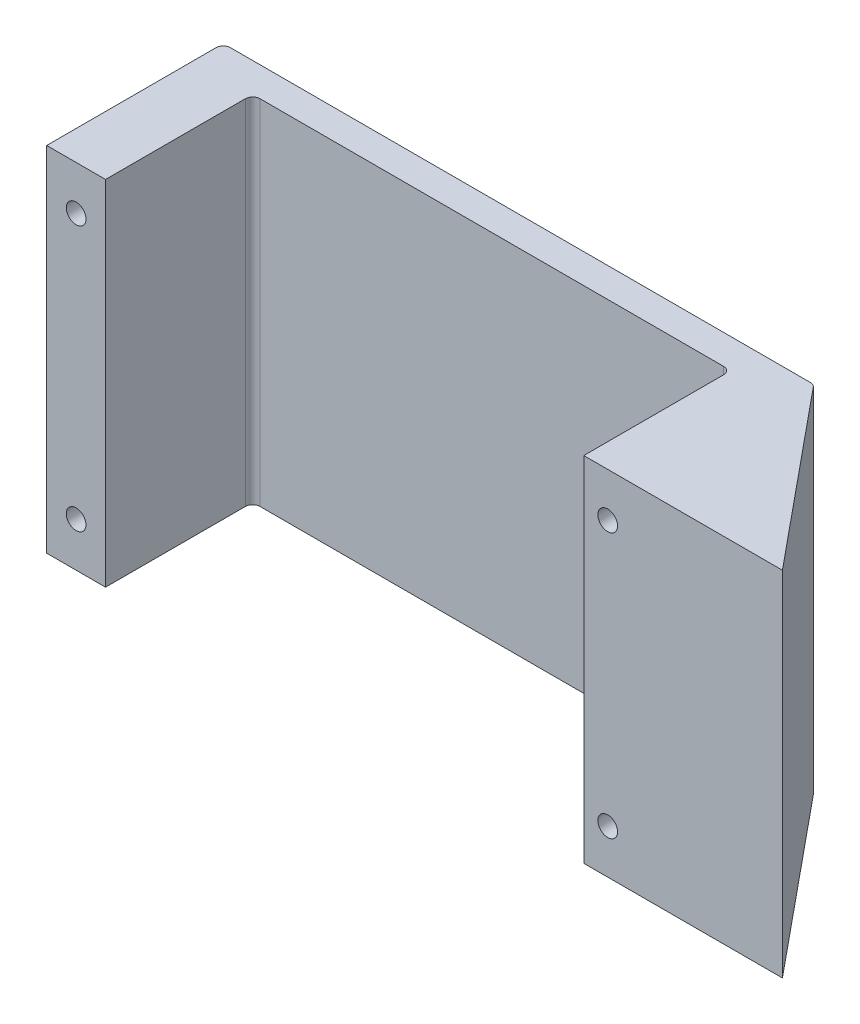
ISO-10303-21;
HEADER;
FILE_DESCRIPTION(('STEP AP214'),'2;1');
FILE_NAME('part.step','',(''),(''),'','','');
FILE_SCHEMA(('AUTOMOTIVE_DESIGN { 1 0 10303 214 1 1 1 1 }'));
ENDSEC;
DATA;
#1=APPLICATION_CONTEXT('core data for automotive mechanical design processes');
#2=APPLICATION_PROTOCOL_DEFINITION('international standard','automotive_design',2000,#1);
#3=PRODUCT_CONTEXT('',#1,'mechanical');
#4=PRODUCT('Part','Part','',(#3));
#5=PRODUCT_RELATED_PRODUCT_CATEGORY('part','',(#4));
#6=PRODUCT_DEFINITION_FORMATION('','',#4);
#7=PRODUCT_DEFINITION_CONTEXT('part definition',#1,'design');
#8=PRODUCT_DEFINITION('design','',#6,#7);
#9=PRODUCT_DEFINITION_SHAPE('','',#8);
#10=(LENGTH_UNIT() NAMED_UNIT(*) SI_UNIT(.MILLI.,.METRE.));
#11=(NAMED_UNIT(*) PLANE_ANGLE_UNIT() SI_UNIT($,.RADIAN.));
#12=(NAMED_UNIT(*) SI_UNIT($,.STERADIAN.) SOLID_ANGLE_UNIT());
#13=UNCERTAINTY_MEASURE_WITH_UNIT(LENGTH_MEASURE(1.E-05),#10,'distance_accuracy_value','');
#14=(GEOMETRIC_REPRESENTATION_CONTEXT(3) GLOBAL_UNCERTAINTY_ASSIGNED_CONTEXT((#13)) GLOBAL_UNIT_ASSIGNED_CONTEXT((#10,
#11,#12)) REPRESENTATION_CONTEXT('',''));
#15=CARTESIAN_POINT('',(0.,0.,0.));
#16=DIRECTION('',(0.,0.,1.));
#17=DIRECTION('',(1.,0.,0.));
#18=AXIS2_PLACEMENT_3D('',#15,#16,#17);
#19=CARTESIAN_POINT('',(-62.9878990236738,-40.64,46.4991854947657));
#20=DIRECTION('',(-1.,0.,0.));
#21=DIRECTION('',(0.,0.,1.));
#22=AXIS2_PLACEMENT_3D('',#19,#20,#21);
#23=PLANE('',#22);
#24=DIRECTION('',(0.,0.,1.));
#25=VECTOR('',#24,1.);
#26=CARTESIAN_POINT('',(-62.9878990236738,20.32,46.4991854947657));
#27=LINE('',#26,#25);
#28=CARTESIAN_POINT('',(-62.9878990236738,20.32,47.7691854947657));
#29=VERTEX_POINT('',#28);
#30=CARTESIAN_POINT('',(-62.9878990236738,20.32,76.9791854947657));
#31=VERTEX_POINT('',#30);
#32=EDGE_CURVE('E128',#29,#31,#27,.T.);
#33=ORIENTED_EDGE('',*,*,#32,.F.);
#34=DIRECTION('',(0.,1.,0.));
#35=VECTOR('',#34,1.);
#36=CARTESIAN_POINT('',(-62.9878990236738,-40.64,47.7691854947657));
#37=LINE('',#36,#35);
#38=CARTESIAN_POINT('',(-62.9878990236738,-40.64,47.7691854947657));
#39=VERTEX_POINT('',#38);
#40=EDGE_CURVE('E54',#29,#39,#37,.F.);
#41=ORIENTED_EDGE('',*,*,#40,.T.);
#42=DIRECTION('',(0.,0.,1.));
#43=VECTOR('',#42,1.);
#44=CARTESIAN_POINT('',(-62.9878990236738,-40.64,46.4991854947657));
#45=LINE('',#44,#43);
#46=CARTESIAN_POINT('',(-62.9878990236738,-40.64,76.9791854947657));
#47=VERTEX_POINT('',#46);
#48=EDGE_CURVE('E142',#39,#47,#45,.T.);
#49=ORIENTED_EDGE('',*,*,#48,.T.);
#50=DIRECTION('',(0.,1.,0.));
#51=VECTOR('',#50,1.);
#52=CARTESIAN_POINT('',(-62.9878990236738,-40.64,76.9791854947657));
#53=LINE('',#52,#51);
#54=EDGE_CURVE('E141',#47,#31,#53,.T.);
#55=ORIENTED_EDGE('',*,*,#54,.T.);
#56=EDGE_LOOP('',(#33,#41,#49,#55));
#57=FACE_BOUND('',#56,.T.);
#58=ADVANCED_FACE('F39',(#57),#23,.T.);
#59=CARTESIAN_POINT('',(38.9403477823427,-40.64,46.4991854947657));
#60=DIRECTION('',(0.,0.,-1.));
#61=DIRECTION('',(-1.,0.,0.));
#62=AXIS2_PLACEMENT_3D('',#59,#60,#61);
#63=PLANE('',#62);
#64=CARTESIAN_POINT('',(-57.9078990236738,-33.02,46.4991854947657));
#65=DIRECTION('',(0.,0.,-1.));
#66=DIRECTION('',(-1.,0.,0.));
#67=AXIS2_PLACEMENT_3D('',#64,#65,#66);
#68=CIRCLE('',#67,3.525);
#69=CARTESIAN_POINT('',(-61.4328990236738,-33.02,46.4991854947657));
#70=VERTEX_POINT('',#69);
#71=EDGE_CURVE('E366',#70,#70,#68,.T.);
#72=ORIENTED_EDGE('',*,*,#71,.F.);
#73=EDGE_LOOP('',(#72));
#74=FACE_BOUND('',#73,.T.);
#75=CARTESIAN_POINT('',(-57.9078990236738,12.7,46.4991854947657));
#76=DIRECTION('',(0.,0.,-1.));
#77=DIRECTION('',(-1.,0.,0.));
#78=AXIS2_PLACEMENT_3D('',#75,#76,#77);
#79=CIRCLE('',#78,3.525);
#80=CARTESIAN_POINT('',(-61.4328990236738,12.7,46.4991854947657));
#81=VERTEX_POINT('',#80);
#82=EDGE_CURVE('E379',#81,#81,#79,.T.);
#83=ORIENTED_EDGE('',*,*,#82,.F.);
#84=EDGE_LOOP('',(#83));
#85=FACE_BOUND('',#84,.T.);
#86=CARTESIAN_POINT('',(33.8603477823427,12.7,46.4991854947657));
#87=DIRECTION('',(0.,0.,-1.));
#88=DIRECTION('',(-1.,0.,0.));
#89=AXIS2_PLACEMENT_3D('',#86,#87,#88);
#90=CIRCLE('',#89,3.525);
#91=CARTESIAN_POINT('',(30.3353477823427,12.7,46.4991854947657));
#92=VERTEX_POINT('',#91);
#93=EDGE_CURVE('E394',#92,#92,#90,.T.);
#94=ORIENTED_EDGE('',*,*,#93,.F.);
#95=EDGE_LOOP('',(#94));
#96=FACE_BOUND('',#95,.T.);
#97=CARTESIAN_POINT('',(33.8603477823427,-33.02,46.4991854947657));
#98=DIRECTION('',(0.,0.,-1.));
#99=DIRECTION('',(-1.,0.,0.));
#100=AXIS2_PLACEMENT_3D('',#97,#98,#99);
#101=CIRCLE('',#100,3.525);
#102=CARTESIAN_POINT('',(30.3353477823427,-33.02,46.4991854947657));
#103=VERTEX_POINT('',#102);
#104=EDGE_CURVE('E409',#103,#103,#101,.T.);
#105=ORIENTED_EDGE('',*,*,#104,.F.);
#106=EDGE_LOOP('',(#105));
#107=FACE_BOUND('',#106,.T.);
#108=DIRECTION('',(-1.,0.,0.));
#109=VECTOR('',#108,1.);
#110=CARTESIAN_POINT('',(38.9403477823427,20.32,46.4991854947657));
#111=LINE('',#110,#109);
#112=CARTESIAN_POINT('',(38.340556854407,20.32,46.4991854947657));
#113=VERTEX_POINT('',#112);
#114=CARTESIAN_POINT('',(-61.7178990236738,20.32,46.4991854947657));
#115=VERTEX_POINT('',#114);
#116=EDGE_CURVE('E165',#113,#115,#111,.T.);
#117=ORIENTED_EDGE('',*,*,#116,.F.);
#118=DIRECTION('',(0.,1.,0.));
#119=VECTOR('',#118,1.);
#120=CARTESIAN_POINT('',(38.340556854407,-40.64,46.4991854947657));
#121=LINE('',#120,#119);
#122=CARTESIAN_POINT('',(38.340556854407,-40.64,46.4991854947657));
#123=VERTEX_POINT('',#122);
#124=EDGE_CURVE('E210',#113,#123,#121,.F.);
#125=ORIENTED_EDGE('',*,*,#124,.T.);
#126=DIRECTION('',(-1.,0.,0.));
#127=VECTOR('',#126,1.);
#128=CARTESIAN_POINT('',(38.9403477823427,-40.64,46.4991854947657));
#129=LINE('',#128,#127);
#130=CARTESIAN_POINT('',(-61.7178990236738,-40.64,46.4991854947657));
#131=VERTEX_POINT('',#130);
#132=EDGE_CURVE('E147',#123,#131,#129,.T.);
#133=ORIENTED_EDGE('',*,*,#132,.T.);
#134=DIRECTION('',(0.,1.,0.));
#135=VECTOR('',#134,1.);
#136=CARTESIAN_POINT('',(-61.7178990236738,-40.64,46.4991854947657));
#137=LINE('',#136,#135);
#138=EDGE_CURVE('E207',#131,#115,#137,.T.);
#139=ORIENTED_EDGE('',*,*,#138,.T.);
#140=EDGE_LOOP('',(#117,#125,#133,#139));
#141=FACE_BOUND('',#140,.T.);
#142=ADVANCED_FACE('F245',(#74,#85,#96,#107,#141),#63,.T.);
#143=CARTESIAN_POINT('',(64.0121009763261,-40.64,76.9791854947657));
#144=DIRECTION('',(0.772295951041188,0.,-0.635262909357526));
#145=DIRECTION('',(-0.635262909357525,0.,-0.772295951041187));
#146=AXIS2_PLACEMENT_3D('',#143,#144,#145);
#147=PLANE('',#146);
#148=DIRECTION('',(-0.635262909357525,0.,-0.772295951041187));
#149=VECTOR('',#148,1.);
#150=CARTESIAN_POINT('',(64.0121009763261,-40.64,76.9791854947657));
#151=LINE('',#150,#149);
#152=CARTESIAN_POINT('',(64.0121009763261,-40.64,76.9791854947657));
#153=VERTEX_POINT('',#152);
#154=CARTESIAN_POINT('',(39.3213727122293,-40.64,46.9624015998817));
#155=VERTEX_POINT('',#154);
#156=EDGE_CURVE('E181',#153,#155,#151,.T.);
#157=ORIENTED_EDGE('',*,*,#156,.T.);
#158=DIRECTION('',(0.,1.,0.));
#159=VECTOR('',#158,1.);
#160=CARTESIAN_POINT('',(39.3213727122293,-40.64,46.9624015998817));
#161=LINE('',#160,#159);
#162=CARTESIAN_POINT('',(39.3213727122293,20.32,46.9624015998817));
#163=VERTEX_POINT('',#162);
#164=EDGE_CURVE('E201',#155,#163,#161,.T.);
#165=ORIENTED_EDGE('',*,*,#164,.T.);
#166=DIRECTION('',(-0.635262909357525,0.,-0.772295951041187));
#167=VECTOR('',#166,1.);
#168=CARTESIAN_POINT('',(64.0121009763261,20.32,76.9791854947657));
#169=LINE('',#168,#167);
#170=CARTESIAN_POINT('',(64.0121009763261,20.32,76.9791854947657));
#171=VERTEX_POINT('',#170);
#172=EDGE_CURVE('E163',#171,#163,#169,.T.);
#173=ORIENTED_EDGE('',*,*,#172,.F.);
#174=DIRECTION('',(0.,1.,0.));
#175=VECTOR('',#174,1.);
#176=CARTESIAN_POINT('',(64.0121009763261,-40.64,76.9791854947657));
#177=LINE('',#176,#175);
#178=EDGE_CURVE('E185',#153,#171,#177,.T.);
#179=ORIENTED_EDGE('',*,*,#178,.F.);
#180=EDGE_LOOP('',(#157,#165,#173,#179));
#181=FACE_BOUND('',#180,.T.);
#182=ADVANCED_FACE('F251',(#181),#147,.T.);
#183=CARTESIAN_POINT('',(29.7221009763261,-40.64,76.9791854947657));
#184=DIRECTION('',(0.,0.,1.));
#185=DIRECTION('',(1.,0.,0.));
#186=AXIS2_PLACEMENT_3D('',#183,#184,#185);
#187=PLANE('',#186);
#188=CARTESIAN_POINT('',(33.8603477823427,12.7,76.9791854947657));
#189=DIRECTION('',(0.,0.,-1.));
#190=DIRECTION('',(-1.,0.,0.));
#191=AXIS2_PLACEMENT_3D('',#188,#189,#190);
#192=CIRCLE('',#191,1.69999999999999);
#193=CARTESIAN_POINT('',(32.1603477823427,12.7,76.9791854947657));
#194=VERTEX_POINT('',#193);
#195=EDGE_CURVE('E406',#194,#194,#192,.T.);
#196=ORIENTED_EDGE('',*,*,#195,.T.);
#197=EDGE_LOOP('',(#196));
#198=FACE_BOUND('',#197,.T.);
#199=CARTESIAN_POINT('',(33.8603477823427,-33.02,76.9791854947657));
#200=DIRECTION('',(0.,0.,-1.));
#201=DIRECTION('',(-1.,0.,0.));
#202=AXIS2_PLACEMENT_3D('',#199,#200,#201);
#203=CIRCLE('',#202,1.69999999999999);
#204=CARTESIAN_POINT('',(32.1603477823427,-33.02,76.9791854947657));
#205=VERTEX_POINT('',#204);
#206=EDGE_CURVE('E138',#205,#205,#203,.T.);
#207=ORIENTED_EDGE('',*,*,#206,.T.);
#208=EDGE_LOOP('',(#207));
#209=FACE_BOUND('',#208,.T.);
#210=ORIENTED_EDGE('',*,*,#178,.T.);
#211=DIRECTION('',(1.,0.,0.));
#212=VECTOR('',#211,1.);
#213=CARTESIAN_POINT('',(29.7221009763261,20.32,76.9791854947657));
#214=LINE('',#213,#212);
#215=CARTESIAN_POINT('',(29.7221009763261,20.32,76.9791854947657));
#216=VERTEX_POINT('',#215);
#217=EDGE_CURVE('E160',#216,#171,#214,.T.);
#218=ORIENTED_EDGE('',*,*,#217,.F.);
#219=DIRECTION('',(0.,1.,0.));
#220=VECTOR('',#219,1.);
#221=CARTESIAN_POINT('',(29.7221009763261,-40.64,76.9791854947657));
#222=LINE('',#221,#220);
#223=CARTESIAN_POINT('',(29.7221009763261,-40.64,76.9791854947657));
#224=VERTEX_POINT('',#223);
#225=EDGE_CURVE('E188',#224,#216,#222,.T.);
#226=ORIENTED_EDGE('',*,*,#225,.F.);
#227=DIRECTION('',(1.,0.,0.));
#228=VECTOR('',#227,1.);
#229=CARTESIAN_POINT('',(29.7221009763261,-40.64,76.9791854947657));
#230=LINE('',#229,#228);
#231=EDGE_CURVE('E178',#224,#153,#230,.T.);
#232=ORIENTED_EDGE('',*,*,#231,.T.);
#233=EDGE_LOOP('',(#210,#218,#226,#232));
#234=FACE_BOUND('',#233,.T.);
#235=ADVANCED_FACE('F277',(#198,#209,#234),#187,.T.);
#236=CARTESIAN_POINT('',(29.7221009763261,-40.64,51.5791854947657));
#237=DIRECTION('',(-1.,0.,0.));
#238=DIRECTION('',(0.,0.,1.));
#239=AXIS2_PLACEMENT_3D('',#236,#237,#238);
#240=PLANE('',#239);
#241=DIRECTION('',(0.,0.,1.));
#242=VECTOR('',#241,1.);
#243=CARTESIAN_POINT('',(29.7221009763261,20.32,51.5791854947657));
#244=LINE('',#243,#242);
#245=CARTESIAN_POINT('',(29.7221009763261,20.32,52.8491854947657));
#246=VERTEX_POINT('',#245);
#247=EDGE_CURVE('E158',#246,#216,#244,.T.);
#248=ORIENTED_EDGE('',*,*,#247,.F.);
#249=DIRECTION('',(0.,1.,0.));
#250=VECTOR('',#249,1.);
#251=CARTESIAN_POINT('',(29.7221009763261,-40.64,52.8491854947657));
#252=LINE('',#251,#250);
#253=CARTESIAN_POINT('',(29.7221009763261,-40.64,52.8491854947657));
#254=VERTEX_POINT('',#253);
#255=EDGE_CURVE('E196',#246,#254,#252,.F.);
#256=ORIENTED_EDGE('',*,*,#255,.T.);
#257=DIRECTION('',(0.,0.,1.));
#258=VECTOR('',#257,1.);
#259=CARTESIAN_POINT('',(29.7221009763261,-40.64,51.5791854947657));
#260=LINE('',#259,#258);
#261=EDGE_CURVE('E176',#254,#224,#260,.T.);
#262=ORIENTED_EDGE('',*,*,#261,.T.);
#263=ORIENTED_EDGE('',*,*,#225,.T.);
#264=EDGE_LOOP('',(#248,#256,#262,#263));
#265=FACE_BOUND('',#264,.T.);
#266=ADVANCED_FACE('F242',(#265),#240,.T.);
#267=CARTESIAN_POINT('',(-52.8278990236738,-40.64,51.5791854947657));
#268=DIRECTION('',(0.,0.,1.));
#269=DIRECTION('',(1.,0.,0.));
#270=AXIS2_PLACEMENT_3D('',#267,#268,#269);
#271=PLANE('',#270);
#272=DIRECTION('',(1.,0.,0.));
#273=VECTOR('',#272,1.);
#274=CARTESIAN_POINT('',(-52.8278990236738,-40.64,51.5791854947657));
#275=LINE('',#274,#273);
#276=CARTESIAN_POINT('',(-51.5578990236738,-40.64,51.5791854947657));
#277=VERTEX_POINT('',#276);
#278=CARTESIAN_POINT('',(28.4521009763261,-40.64,51.5791854947657));
#279=VERTEX_POINT('',#278);
#280=EDGE_CURVE('E173',#277,#279,#275,.T.);
#281=ORIENTED_EDGE('',*,*,#280,.T.);
#282=DIRECTION('',(0.,1.,0.));
#283=VECTOR('',#282,1.);
#284=CARTESIAN_POINT('',(28.4521009763261,20.32,51.5791854947657));
#285=LINE('',#284,#283);
#286=CARTESIAN_POINT('',(28.4521009763261,20.32,51.5791854947657));
#287=VERTEX_POINT('',#286);
#288=EDGE_CURVE('E193',#279,#287,#285,.T.);
#289=ORIENTED_EDGE('',*,*,#288,.T.);
#290=DIRECTION('',(1.,0.,0.));
#291=VECTOR('',#290,1.);
#292=CARTESIAN_POINT('',(-52.8278990236738,20.32,51.5791854947657));
#293=LINE('',#292,#291);
#294=CARTESIAN_POINT('',(-51.5578990236738,20.32,51.5791854947657));
#295=VERTEX_POINT('',#294);
#296=EDGE_CURVE('E152',#295,#287,#293,.T.);
#297=ORIENTED_EDGE('',*,*,#296,.F.);
#298=DIRECTION('',(0.,1.,0.));
#299=VECTOR('',#298,1.);
#300=CARTESIAN_POINT('',(-51.5578990236738,-40.64,51.5791854947657));
#301=LINE('',#300,#299);
#302=EDGE_CURVE('E187',#295,#277,#301,.F.);
#303=ORIENTED_EDGE('',*,*,#302,.T.);
#304=EDGE_LOOP('',(#281,#289,#297,#303));
#305=FACE_BOUND('',#304,.T.);
#306=ADVANCED_FACE('F224',(#305),#271,.T.);
#307=CARTESIAN_POINT('',(-52.8278990236738,-40.64,76.9791854947657));
#308=DIRECTION('',(1.,0.,0.));
#309=DIRECTION('',(0.,0.,-1.));
#310=AXIS2_PLACEMENT_3D('',#307,#308,#309);
#311=PLANE('',#310);
#312=DIRECTION('',(0.,0.,-1.));
#313=VECTOR('',#312,1.);
#314=CARTESIAN_POINT('',(-52.8278990236738,-40.64,76.9791854947657));
#315=LINE('',#314,#313);
#316=CARTESIAN_POINT('',(-52.8278990236738,-40.64,76.9791854947657));
#317=VERTEX_POINT('',#316);
#318=CARTESIAN_POINT('',(-52.8278990236738,-40.64,52.8491854947657));
#319=VERTEX_POINT('',#318);
#320=EDGE_CURVE('E170',#317,#319,#315,.T.);
#321=ORIENTED_EDGE('',*,*,#320,.T.);
#322=DIRECTION('',(0.,1.,0.));
#323=VECTOR('',#322,1.);
#324=CARTESIAN_POINT('',(-52.8278990236738,20.32,52.8491854947657));
#325=LINE('',#324,#323);
#326=CARTESIAN_POINT('',(-52.8278990236738,20.32,52.8491854947657));
#327=VERTEX_POINT('',#326);
#328=EDGE_CURVE('E198',#319,#327,#325,.T.);
#329=ORIENTED_EDGE('',*,*,#328,.T.);
#330=DIRECTION('',(0.,0.,-1.));
#331=VECTOR('',#330,1.);
#332=CARTESIAN_POINT('',(-52.8278990236738,20.32,76.9791854947657));
#333=LINE('',#332,#331);
#334=CARTESIAN_POINT('',(-52.8278990236738,20.32,76.9791854947657));
#335=VERTEX_POINT('',#334);
#336=EDGE_CURVE('E150',#335,#327,#333,.T.);
#337=ORIENTED_EDGE('',*,*,#336,.F.);
#338=DIRECTION('',(0.,1.,0.));
#339=VECTOR('',#338,1.);
#340=CARTESIAN_POINT('',(-52.8278990236738,-40.64,76.9791854947657));
#341=LINE('',#340,#339);
#342=EDGE_CURVE('E146',#317,#335,#341,.T.);
#343=ORIENTED_EDGE('',*,*,#342,.F.);
#344=EDGE_LOOP('',(#321,#329,#337,#343));
#345=FACE_BOUND('',#344,.T.);
#346=ADVANCED_FACE('F232',(#345),#311,.T.);
#347=CARTESIAN_POINT('',(-52.8278990236738,-40.64,76.9791854947657));
#348=DIRECTION('',(0.,0.,1.));
#349=DIRECTION('',(1.,0.,0.));
#350=AXIS2_PLACEMENT_3D('',#347,#348,#349);
#351=PLANE('',#350);
#352=CARTESIAN_POINT('',(-57.9078990236738,-33.02,76.9791854947657));
#353=DIRECTION('',(0.,0.,-1.));
#354=DIRECTION('',(-1.,0.,0.));
#355=AXIS2_PLACEMENT_3D('',#352,#353,#354);
#356=CIRCLE('',#355,1.69999999999999);
#357=CARTESIAN_POINT('',(-59.6078990236738,-33.02,76.9791854947657));
#358=VERTEX_POINT('',#357);
#359=EDGE_CURVE('E376',#358,#358,#356,.T.);
#360=ORIENTED_EDGE('',*,*,#359,.T.);
#361=EDGE_LOOP('',(#360));
#362=FACE_BOUND('',#361,.T.);
#363=CARTESIAN_POINT('',(-57.9078990236738,12.7,76.9791854947657));
#364=DIRECTION('',(0.,0.,-1.));
#365=DIRECTION('',(-1.,0.,0.));
#366=AXIS2_PLACEMENT_3D('',#363,#364,#365);
#367=CIRCLE('',#366,1.69999999999999);
#368=CARTESIAN_POINT('',(-59.6078990236738,12.7,76.9791854947657));
#369=VERTEX_POINT('',#368);
#370=EDGE_CURVE('E391',#369,#369,#367,.T.);
#371=ORIENTED_EDGE('',*,*,#370,.T.);
#372=EDGE_LOOP('',(#371));
#373=FACE_BOUND('',#372,.T.);
#374=ORIENTED_EDGE('',*,*,#342,.T.);
#375=DIRECTION('',(1.,0.,0.));
#376=VECTOR('',#375,1.);
#377=CARTESIAN_POINT('',(-52.8278990236738,20.32,76.9791854947657));
#378=LINE('',#377,#376);
#379=EDGE_CURVE('E134',#31,#335,#378,.T.);
#380=ORIENTED_EDGE('',*,*,#379,.F.);
#381=ORIENTED_EDGE('',*,*,#54,.F.);
#382=DIRECTION('',(1.,0.,0.));
#383=VECTOR('',#382,1.);
#384=CARTESIAN_POINT('',(-52.8278990236738,-40.64,76.9791854947657));
#385=LINE('',#384,#383);
#386=EDGE_CURVE('E168',#47,#317,#385,.T.);
#387=ORIENTED_EDGE('',*,*,#386,.T.);
#388=EDGE_LOOP('',(#374,#380,#381,#387));
#389=FACE_BOUND('',#388,.T.);
#390=ADVANCED_FACE('F149',(#362,#373,#389),#351,.T.);
#391=CARTESIAN_POINT('',(0.,-40.64,0.));
#392=DIRECTION('',(0.,-1.,0.));
#393=DIRECTION('',(0.,0.,-1.));
#394=AXIS2_PLACEMENT_3D('',#391,#392,#393);
#395=PLANE('',#394);
#396=ORIENTED_EDGE('',*,*,#132,.F.);
#397=CARTESIAN_POINT('',(38.340556854407,-40.64,47.7691854947657));
#398=DIRECTION('',(0.,-1.,0.));
#399=DIRECTION('',(0.,0.,-1.));
#400=AXIS2_PLACEMENT_3D('',#397,#398,#399);
#401=CIRCLE('',#400,1.27);
#402=EDGE_CURVE('E213',#123,#155,#401,.T.);
#403=ORIENTED_EDGE('',*,*,#402,.T.);
#404=ORIENTED_EDGE('',*,*,#156,.F.);
#405=ORIENTED_EDGE('',*,*,#231,.F.);
#406=ORIENTED_EDGE('',*,*,#261,.F.);
#407=CARTESIAN_POINT('',(28.4521009763261,-40.64,52.8491854947657));
#408=DIRECTION('',(0.,-1.,0.));
#409=DIRECTION('',(0.,0.,-1.));
#410=AXIS2_PLACEMENT_3D('',#407,#408,#409);
#411=CIRCLE('',#410,1.27);
#412=EDGE_CURVE('E218',#254,#279,#411,.F.);
#413=ORIENTED_EDGE('',*,*,#412,.T.);
#414=ORIENTED_EDGE('',*,*,#280,.F.);
#415=CARTESIAN_POINT('',(-51.5578990236738,-40.64,52.8491854947657));
#416=DIRECTION('',(0.,-1.,0.));
#417=DIRECTION('',(0.,0.,-1.));
#418=AXIS2_PLACEMENT_3D('',#415,#416,#417);
#419=CIRCLE('',#418,1.27);
#420=EDGE_CURVE('E11',#277,#319,#419,.F.);
#421=ORIENTED_EDGE('',*,*,#420,.T.);
#422=ORIENTED_EDGE('',*,*,#320,.F.);
#423=ORIENTED_EDGE('',*,*,#386,.F.);
#424=ORIENTED_EDGE('',*,*,#48,.F.);
#425=CARTESIAN_POINT('',(-61.7178990236738,-40.64,47.7691854947657));
#426=DIRECTION('',(0.,-1.,0.));
#427=DIRECTION('',(0.,0.,-1.));
#428=AXIS2_PLACEMENT_3D('',#425,#426,#427);
#429=CIRCLE('',#428,1.27);
#430=EDGE_CURVE('E61',#39,#131,#429,.T.);
#431=ORIENTED_EDGE('',*,*,#430,.T.);
#432=EDGE_LOOP('',(#396,#403,#404,#405,#406,#413,#414,#421,#422,#423,#424,#431));
#433=FACE_BOUND('',#432,.T.);
#434=ADVANCED_FACE('F230',(#433),#395,.T.);
#435=CARTESIAN_POINT('',(0.,20.32,0.));
#436=DIRECTION('',(0.,-1.,0.));
#437=DIRECTION('',(0.,0.,-1.));
#438=AXIS2_PLACEMENT_3D('',#435,#436,#437);
#439=PLANE('',#438);
#440=ORIENTED_EDGE('',*,*,#172,.T.);
#441=CARTESIAN_POINT('',(38.340556854407,20.32,47.7691854947657));
#442=DIRECTION('',(0.,-1.,0.));
#443=DIRECTION('',(0.,0.,-1.));
#444=AXIS2_PLACEMENT_3D('',#441,#442,#443);
#445=CIRCLE('',#444,1.27);
#446=EDGE_CURVE('E205',#163,#113,#445,.F.);
#447=ORIENTED_EDGE('',*,*,#446,.T.);
#448=ORIENTED_EDGE('',*,*,#116,.T.);
#449=CARTESIAN_POINT('',(-61.7178990236738,20.32,47.7691854947657));
#450=DIRECTION('',(0.,-1.,0.));
#451=DIRECTION('',(0.,0.,-1.));
#452=AXIS2_PLACEMENT_3D('',#449,#450,#451);
#453=CIRCLE('',#452,1.27);
#454=EDGE_CURVE('E137',#115,#29,#453,.F.);
#455=ORIENTED_EDGE('',*,*,#454,.T.);
#456=ORIENTED_EDGE('',*,*,#32,.T.);
#457=ORIENTED_EDGE('',*,*,#379,.T.);
#458=ORIENTED_EDGE('',*,*,#336,.T.);
#459=CARTESIAN_POINT('',(-51.5578990236738,20.32,52.8491854947657));
#460=DIRECTION('',(0.,-1.,0.));
#461=DIRECTION('',(0.,0.,-1.));
#462=AXIS2_PLACEMENT_3D('',#459,#460,#461);
#463=CIRCLE('',#462,1.27);
#464=EDGE_CURVE('E47',#327,#295,#463,.T.);
#465=ORIENTED_EDGE('',*,*,#464,.T.);
#466=ORIENTED_EDGE('',*,*,#296,.T.);
#467=CARTESIAN_POINT('',(28.4521009763261,20.32,52.8491854947657));
#468=DIRECTION('',(0.,-1.,0.));
#469=DIRECTION('',(0.,0.,-1.));
#470=AXIS2_PLACEMENT_3D('',#467,#468,#469);
#471=CIRCLE('',#470,1.27);
#472=EDGE_CURVE('E216',#287,#246,#471,.T.);
#473=ORIENTED_EDGE('',*,*,#472,.T.);
#474=ORIENTED_EDGE('',*,*,#247,.T.);
#475=ORIENTED_EDGE('',*,*,#217,.T.);
#476=EDGE_LOOP('',(#440,#447,#448,#455,#456,#457,#458,#465,#466,#473,#474,#475));
#477=FACE_BOUND('',#476,.T.);
#478=ADVANCED_FACE('F131',(#477),#439,.F.);
#479=CARTESIAN_POINT('',(33.8603477823427,-33.02,46.4991854947657));
#480=DIRECTION('',(0.,0.,-1.));
#481=DIRECTION('',(-1.,0.,0.));
#482=AXIS2_PLACEMENT_3D('',#479,#480,#481);
#483=CYLINDRICAL_SURFACE('',#482,1.7);
#484=ORIENTED_EDGE('',*,*,#206,.F.);
#485=EDGE_LOOP('',(#484));
#486=FACE_BOUND('',#485,.T.);
#487=CARTESIAN_POINT('',(33.8603477823427,-33.02,48.8991854947657));
#488=DIRECTION('',(0.,0.,-1.));
#489=DIRECTION('',(-1.,0.,0.));
#490=AXIS2_PLACEMENT_3D('',#487,#488,#489);
#491=CIRCLE('',#490,1.7);
#492=CARTESIAN_POINT('',(32.1603477823427,-33.02,48.8991854947657));
#493=VERTEX_POINT('',#492);
#494=EDGE_CURVE('E418',#493,#493,#491,.T.);
#495=ORIENTED_EDGE('',*,*,#494,.T.);
#496=EDGE_LOOP('',(#495));
#497=FACE_BOUND('',#496,.T.);
#498=ADVANCED_FACE('F297',(#486,#497),#483,.F.);
#499=CARTESIAN_POINT('',(37.3603477823427,-33.02,48.8991854947657));
#500=DIRECTION('',(0.,0.,1.));
#501=DIRECTION('',(1.,0.,0.));
#502=AXIS2_PLACEMENT_3D('',#499,#500,#501);
#503=PLANE('',#502);
#504=ORIENTED_EDGE('',*,*,#494,.F.);
#505=EDGE_LOOP('',(#504));
#506=FACE_BOUND('',#505,.T.);
#507=CARTESIAN_POINT('',(33.8603477823427,-33.02,48.8991854947657));
#508=DIRECTION('',(0.,0.,-1.));
#509=DIRECTION('',(-1.,0.,0.));
#510=AXIS2_PLACEMENT_3D('',#507,#508,#509);
#511=CIRCLE('',#510,3.5);
#512=CARTESIAN_POINT('',(30.3603477823427,-33.02,48.8991854947657));
#513=VERTEX_POINT('',#512);
#514=EDGE_CURVE('E415',#513,#513,#511,.T.);
#515=ORIENTED_EDGE('',*,*,#514,.T.);
#516=EDGE_LOOP('',(#515));
#517=FACE_BOUND('',#516,.T.);
#518=ADVANCED_FACE('F300',(#506,#517),#503,.F.);
#519=CARTESIAN_POINT('',(33.8603477823427,-33.02,46.4991854947657));
#520=DIRECTION('',(0.,0.,-1.));
#521=DIRECTION('',(-1.,0.,0.));
#522=AXIS2_PLACEMENT_3D('',#519,#520,#521);
#523=CYLINDRICAL_SURFACE('',#522,3.5);
#524=ORIENTED_EDGE('',*,*,#514,.F.);
#525=EDGE_LOOP('',(#524));
#526=FACE_BOUND('',#525,.T.);
#527=CARTESIAN_POINT('',(33.8603477823427,-33.02,46.5241854947657));
#528=DIRECTION('',(0.,0.,-1.));
#529=DIRECTION('',(-1.,0.,0.));
#530=AXIS2_PLACEMENT_3D('',#527,#528,#529);
#531=CIRCLE('',#530,3.5);
#532=CARTESIAN_POINT('',(30.3603477823427,-33.02,46.5241854947657));
#533=VERTEX_POINT('',#532);
#534=EDGE_CURVE('E412',#533,#533,#531,.T.);
#535=ORIENTED_EDGE('',*,*,#534,.T.);
#536=EDGE_LOOP('',(#535));
#537=FACE_BOUND('',#536,.T.);
#538=ADVANCED_FACE('F304',(#526,#537),#523,.F.);
#539=CARTESIAN_POINT('',(33.8603477823427,-33.02,46.4991854947657));
#540=DIRECTION('',(0.,0.,-1.));
#541=DIRECTION('',(-1.,0.,0.));
#542=AXIS2_PLACEMENT_3D('',#539,#540,#541);
#543=CONICAL_SURFACE('',#542,3.525,0.785398163397448);
#544=ORIENTED_EDGE('',*,*,#534,.F.);
#545=EDGE_LOOP('',(#544));
#546=FACE_BOUND('',#545,.T.);
#547=ORIENTED_EDGE('',*,*,#104,.T.);
#548=EDGE_LOOP('',(#547));
#549=FACE_BOUND('',#548,.T.);
#550=ADVANCED_FACE('F308',(#546,#549),#543,.F.);
#551=CARTESIAN_POINT('',(33.8603477823427,12.7,46.4991854947657));
#552=DIRECTION('',(0.,0.,-1.));
#553=DIRECTION('',(-1.,0.,0.));
#554=AXIS2_PLACEMENT_3D('',#551,#552,#553);
#555=CYLINDRICAL_SURFACE('',#554,1.7);
#556=ORIENTED_EDGE('',*,*,#195,.F.);
#557=EDGE_LOOP('',(#556));
#558=FACE_BOUND('',#557,.T.);
#559=CARTESIAN_POINT('',(33.8603477823427,12.7,48.8991854947657));
#560=DIRECTION('',(0.,0.,-1.));
#561=DIRECTION('',(-1.,0.,0.));
#562=AXIS2_PLACEMENT_3D('',#559,#560,#561);
#563=CIRCLE('',#562,1.7);
#564=CARTESIAN_POINT('',(32.1603477823427,12.7,48.8991854947657));
#565=VERTEX_POINT('',#564);
#566=EDGE_CURVE('E403',#565,#565,#563,.T.);
#567=ORIENTED_EDGE('',*,*,#566,.T.);
#568=EDGE_LOOP('',(#567));
#569=FACE_BOUND('',#568,.T.);
#570=ADVANCED_FACE('F312',(#558,#569),#555,.F.);
#571=CARTESIAN_POINT('',(37.3603477823427,12.7,48.8991854947657));
#572=DIRECTION('',(0.,0.,1.));
#573=DIRECTION('',(1.,0.,0.));
#574=AXIS2_PLACEMENT_3D('',#571,#572,#573);
#575=PLANE('',#574);
#576=ORIENTED_EDGE('',*,*,#566,.F.);
#577=EDGE_LOOP('',(#576));
#578=FACE_BOUND('',#577,.T.);
#579=CARTESIAN_POINT('',(33.8603477823427,12.7,48.8991854947657));
#580=DIRECTION('',(0.,0.,-1.));
#581=DIRECTION('',(-1.,0.,0.));
#582=AXIS2_PLACEMENT_3D('',#579,#580,#581);
#583=CIRCLE('',#582,3.5);
#584=CARTESIAN_POINT('',(30.3603477823427,12.7,48.8991854947657));
#585=VERTEX_POINT('',#584);
#586=EDGE_CURVE('E400',#585,#585,#583,.T.);
#587=ORIENTED_EDGE('',*,*,#586,.T.);
#588=EDGE_LOOP('',(#587));
#589=FACE_BOUND('',#588,.T.);
#590=ADVANCED_FACE('F316',(#578,#589),#575,.F.);
#591=CARTESIAN_POINT('',(33.8603477823427,12.7,46.4991854947657));
#592=DIRECTION('',(0.,0.,-1.));
#593=DIRECTION('',(-1.,0.,0.));
#594=AXIS2_PLACEMENT_3D('',#591,#592,#593);
#595=CYLINDRICAL_SURFACE('',#594,3.5);
#596=ORIENTED_EDGE('',*,*,#586,.F.);
#597=EDGE_LOOP('',(#596));
#598=FACE_BOUND('',#597,.T.);
#599=CARTESIAN_POINT('',(33.8603477823427,12.7,46.5241854947657));
#600=DIRECTION('',(0.,0.,-1.));
#601=DIRECTION('',(-1.,0.,0.));
#602=AXIS2_PLACEMENT_3D('',#599,#600,#601);
#603=CIRCLE('',#602,3.5);
#604=CARTESIAN_POINT('',(30.3603477823427,12.7,46.5241854947657));
#605=VERTEX_POINT('',#604);
#606=EDGE_CURVE('E397',#605,#605,#603,.T.);
#607=ORIENTED_EDGE('',*,*,#606,.T.);
#608=EDGE_LOOP('',(#607));
#609=FACE_BOUND('',#608,.T.);
#610=ADVANCED_FACE('F320',(#598,#609),#595,.F.);
#611=CARTESIAN_POINT('',(33.8603477823427,12.7,46.4991854947657));
#612=DIRECTION('',(0.,0.,-1.));
#613=DIRECTION('',(-1.,0.,0.));
#614=AXIS2_PLACEMENT_3D('',#611,#612,#613);
#615=CONICAL_SURFACE('',#614,3.525,0.785398163397448);
#616=ORIENTED_EDGE('',*,*,#606,.F.);
#617=EDGE_LOOP('',(#616));
#618=FACE_BOUND('',#617,.T.);
#619=ORIENTED_EDGE('',*,*,#93,.T.);
#620=EDGE_LOOP('',(#619));
#621=FACE_BOUND('',#620,.T.);
#622=ADVANCED_FACE('F324',(#618,#621),#615,.F.);
#623=CARTESIAN_POINT('',(-57.9078990236738,12.7,46.4991854947657));
#624=DIRECTION('',(0.,0.,-1.));
#625=DIRECTION('',(-1.,0.,0.));
#626=AXIS2_PLACEMENT_3D('',#623,#624,#625);
#627=CYLINDRICAL_SURFACE('',#626,1.7);
#628=ORIENTED_EDGE('',*,*,#370,.F.);
#629=EDGE_LOOP('',(#628));
#630=FACE_BOUND('',#629,.T.);
#631=CARTESIAN_POINT('',(-57.9078990236738,12.7,48.8991854947657));
#632=DIRECTION('',(0.,0.,-1.));
#633=DIRECTION('',(-1.,0.,0.));
#634=AXIS2_PLACEMENT_3D('',#631,#632,#633);
#635=CIRCLE('',#634,1.7);
#636=CARTESIAN_POINT('',(-59.6078990236738,12.7,48.8991854947657));
#637=VERTEX_POINT('',#636);
#638=EDGE_CURVE('E388',#637,#637,#635,.T.);
#639=ORIENTED_EDGE('',*,*,#638,.T.);
#640=EDGE_LOOP('',(#639));
#641=FACE_BOUND('',#640,.T.);
#642=ADVANCED_FACE('F328',(#630,#641),#627,.F.);
#643=CARTESIAN_POINT('',(-54.4078990236738,12.7,48.8991854947657));
#644=DIRECTION('',(0.,0.,1.));
#645=DIRECTION('',(1.,0.,0.));
#646=AXIS2_PLACEMENT_3D('',#643,#644,#645);
#647=PLANE('',#646);
#648=ORIENTED_EDGE('',*,*,#638,.F.);
#649=EDGE_LOOP('',(#648));
#650=FACE_BOUND('',#649,.T.);
#651=CARTESIAN_POINT('',(-57.9078990236738,12.7,48.8991854947657));
#652=DIRECTION('',(0.,0.,-1.));
#653=DIRECTION('',(-1.,0.,0.));
#654=AXIS2_PLACEMENT_3D('',#651,#652,#653);
#655=CIRCLE('',#654,3.5);
#656=CARTESIAN_POINT('',(-61.4078990236738,12.7,48.8991854947657));
#657=VERTEX_POINT('',#656);
#658=EDGE_CURVE('E385',#657,#657,#655,.T.);
#659=ORIENTED_EDGE('',*,*,#658,.T.);
#660=EDGE_LOOP('',(#659));
#661=FACE_BOUND('',#660,.T.);
#662=ADVANCED_FACE('F332',(#650,#661),#647,.F.);
#663=CARTESIAN_POINT('',(-57.9078990236738,12.7,46.4991854947657));
#664=DIRECTION('',(0.,0.,-1.));
#665=DIRECTION('',(-1.,0.,0.));
#666=AXIS2_PLACEMENT_3D('',#663,#664,#665);
#667=CYLINDRICAL_SURFACE('',#666,3.5);
#668=ORIENTED_EDGE('',*,*,#658,.F.);
#669=EDGE_LOOP('',(#668));
#670=FACE_BOUND('',#669,.T.);
#671=CARTESIAN_POINT('',(-57.9078990236738,12.7,46.5241854947657));
#672=DIRECTION('',(0.,0.,-1.));
#673=DIRECTION('',(-1.,0.,0.));
#674=AXIS2_PLACEMENT_3D('',#671,#672,#673);
#675=CIRCLE('',#674,3.5);
#676=CARTESIAN_POINT('',(-61.4078990236738,12.7,46.5241854947657));
#677=VERTEX_POINT('',#676);
#678=EDGE_CURVE('E382',#677,#677,#675,.T.);
#679=ORIENTED_EDGE('',*,*,#678,.T.);
#680=EDGE_LOOP('',(#679));
#681=FACE_BOUND('',#680,.T.);
#682=ADVANCED_FACE('F336',(#670,#681),#667,.F.);
#683=CARTESIAN_POINT('',(-57.9078990236738,12.7,46.4991854947657));
#684=DIRECTION('',(0.,0.,-1.));
#685=DIRECTION('',(-1.,0.,0.));
#686=AXIS2_PLACEMENT_3D('',#683,#684,#685);
#687=CONICAL_SURFACE('',#686,3.525,0.785398163397448);
#688=ORIENTED_EDGE('',*,*,#678,.F.);
#689=EDGE_LOOP('',(#688));
#690=FACE_BOUND('',#689,.T.);
#691=ORIENTED_EDGE('',*,*,#82,.T.);
#692=EDGE_LOOP('',(#691));
#693=FACE_BOUND('',#692,.T.);
#694=ADVANCED_FACE('F340',(#690,#693),#687,.F.);
#695=CARTESIAN_POINT('',(-57.9078990236738,-33.02,46.4991854947657));
#696=DIRECTION('',(0.,0.,-1.));
#697=DIRECTION('',(-1.,0.,0.));
#698=AXIS2_PLACEMENT_3D('',#695,#696,#697);
#699=CYLINDRICAL_SURFACE('',#698,1.7);
#700=ORIENTED_EDGE('',*,*,#359,.F.);
#701=EDGE_LOOP('',(#700));
#702=FACE_BOUND('',#701,.T.);
#703=CARTESIAN_POINT('',(-57.9078990236738,-33.02,48.8991854947657));
#704=DIRECTION('',(0.,0.,-1.));
#705=DIRECTION('',(-1.,0.,0.));
#706=AXIS2_PLACEMENT_3D('',#703,#704,#705);
#707=CIRCLE('',#706,1.7);
#708=CARTESIAN_POINT('',(-59.6078990236738,-33.02,48.8991854947657));
#709=VERTEX_POINT('',#708);
#710=EDGE_CURVE('E373',#709,#709,#707,.T.);
#711=ORIENTED_EDGE('',*,*,#710,.T.);
#712=EDGE_LOOP('',(#711));
#713=FACE_BOUND('',#712,.T.);
#714=ADVANCED_FACE('F344',(#702,#713),#699,.F.);
#715=CARTESIAN_POINT('',(-54.4078990236738,-33.02,48.8991854947657));
#716=DIRECTION('',(0.,0.,1.));
#717=DIRECTION('',(1.,0.,0.));
#718=AXIS2_PLACEMENT_3D('',#715,#716,#717);
#719=PLANE('',#718);
#720=ORIENTED_EDGE('',*,*,#710,.F.);
#721=EDGE_LOOP('',(#720));
#722=FACE_BOUND('',#721,.T.);
#723=CARTESIAN_POINT('',(-57.9078990236738,-33.02,48.8991854947657));
#724=DIRECTION('',(0.,0.,-1.));
#725=DIRECTION('',(-1.,0.,0.));
#726=AXIS2_PLACEMENT_3D('',#723,#724,#725);
#727=CIRCLE('',#726,3.5);
#728=CARTESIAN_POINT('',(-61.4078990236738,-33.02,48.8991854947657));
#729=VERTEX_POINT('',#728);
#730=EDGE_CURVE('E368',#729,#729,#727,.T.);
#731=ORIENTED_EDGE('',*,*,#730,.T.);
#732=EDGE_LOOP('',(#731));
#733=FACE_BOUND('',#732,.T.);
#734=ADVANCED_FACE('F348',(#722,#733),#719,.F.);
#735=CARTESIAN_POINT('',(-57.9078990236738,-33.02,46.4991854947657));
#736=DIRECTION('',(0.,0.,-1.));
#737=DIRECTION('',(-1.,0.,0.));
#738=AXIS2_PLACEMENT_3D('',#735,#736,#737);
#739=CYLINDRICAL_SURFACE('',#738,3.5);
#740=ORIENTED_EDGE('',*,*,#730,.F.);
#741=EDGE_LOOP('',(#740));
#742=FACE_BOUND('',#741,.T.);
#743=CARTESIAN_POINT('',(-57.9078990236738,-33.02,46.5241854947657));
#744=DIRECTION('',(0.,0.,-1.));
#745=DIRECTION('',(-1.,0.,0.));
#746=AXIS2_PLACEMENT_3D('',#743,#744,#745);
#747=CIRCLE('',#746,3.5);
#748=CARTESIAN_POINT('',(-61.4078990236738,-33.02,46.5241854947657));
#749=VERTEX_POINT('',#748);
#750=EDGE_CURVE('E363',#749,#749,#747,.T.);
#751=ORIENTED_EDGE('',*,*,#750,.T.);
#752=EDGE_LOOP('',(#751));
#753=FACE_BOUND('',#752,.T.);
#754=ADVANCED_FACE('F352',(#742,#753),#739,.F.);
#755=CARTESIAN_POINT('',(-57.9078990236738,-33.02,46.4991854947657));
#756=DIRECTION('',(0.,0.,-1.));
#757=DIRECTION('',(-1.,0.,0.));
#758=AXIS2_PLACEMENT_3D('',#755,#756,#757);
#759=CONICAL_SURFACE('',#758,3.525,0.785398163397448);
#760=ORIENTED_EDGE('',*,*,#750,.F.);
#761=EDGE_LOOP('',(#760));
#762=FACE_BOUND('',#761,.T.);
#763=ORIENTED_EDGE('',*,*,#71,.T.);
#764=EDGE_LOOP('',(#763));
#765=FACE_BOUND('',#764,.T.);
#766=ADVANCED_FACE('F258',(#762,#765),#759,.F.);
#767=CARTESIAN_POINT('',(28.4521009763261,-40.64,52.8491854947657));
#768=DIRECTION('',(0.,-1.,0.));
#769=DIRECTION('',(0.,0.,-1.));
#770=AXIS2_PLACEMENT_3D('',#767,#768,#769);
#771=CYLINDRICAL_SURFACE('',#770,1.27);
#772=ORIENTED_EDGE('',*,*,#412,.F.);
#773=ORIENTED_EDGE('',*,*,#255,.F.);
#774=ORIENTED_EDGE('',*,*,#472,.F.);
#775=ORIENTED_EDGE('',*,*,#288,.F.);
#776=EDGE_LOOP('',(#772,#773,#774,#775));
#777=FACE_BOUND('',#776,.T.);
#778=ADVANCED_FACE('F255',(#777),#771,.F.);
#779=CARTESIAN_POINT('',(-51.5578990236738,-40.64,52.8491854947657));
#780=DIRECTION('',(0.,-1.,0.));
#781=DIRECTION('',(0.,0.,-1.));
#782=AXIS2_PLACEMENT_3D('',#779,#780,#781);
#783=CYLINDRICAL_SURFACE('',#782,1.27);
#784=ORIENTED_EDGE('',*,*,#420,.F.);
#785=ORIENTED_EDGE('',*,*,#302,.F.);
#786=ORIENTED_EDGE('',*,*,#464,.F.);
#787=ORIENTED_EDGE('',*,*,#328,.F.);
#788=EDGE_LOOP('',(#784,#785,#786,#787));
#789=FACE_BOUND('',#788,.T.);
#790=ADVANCED_FACE('F228',(#789),#783,.F.);
#791=CARTESIAN_POINT('',(38.340556854407,-40.64,47.7691854947657));
#792=DIRECTION('',(0.,1.,0.));
#793=DIRECTION('',(0.,0.,1.));
#794=AXIS2_PLACEMENT_3D('',#791,#792,#793);
#795=CYLINDRICAL_SURFACE('',#794,1.27);
#796=ORIENTED_EDGE('',*,*,#402,.F.);
#797=ORIENTED_EDGE('',*,*,#124,.F.);
#798=ORIENTED_EDGE('',*,*,#446,.F.);
#799=ORIENTED_EDGE('',*,*,#164,.F.);
#800=EDGE_LOOP('',(#796,#797,#798,#799));
#801=FACE_BOUND('',#800,.T.);
#802=ADVANCED_FACE('F261',(#801),#795,.T.);
#803=CARTESIAN_POINT('',(-61.7178990236738,-40.64,47.7691854947657));
#804=DIRECTION('',(0.,1.,0.));
#805=DIRECTION('',(0.,0.,1.));
#806=AXIS2_PLACEMENT_3D('',#803,#804,#805);
#807=CYLINDRICAL_SURFACE('',#806,1.27);
#808=ORIENTED_EDGE('',*,*,#430,.F.);
#809=ORIENTED_EDGE('',*,*,#40,.F.);
#810=ORIENTED_EDGE('',*,*,#454,.F.);
#811=ORIENTED_EDGE('',*,*,#138,.F.);
#812=EDGE_LOOP('',(#808,#809,#810,#811));
#813=FACE_BOUND('',#812,.T.);
#814=ADVANCED_FACE('F41',(#813),#807,.T.);
#815=CLOSED_SHELL('',(#58,#142,#182,#235,#266,#306,#346,#390,#434,#478,#498,#518,#538,#550,#570,
#590,#610,#622,#642,#662,#682,#694,#714,#734,#754,#766,#778,#790,#802,#814));
#816=MANIFOLD_SOLID_BREP('B2',#815);
#817=ADVANCED_BREP_SHAPE_REPRESENTATION('',(#18,#816),#14);
#818=SHAPE_DEFINITION_REPRESENTATION(#9,#817);
ENDSEC;
END-ISO-10303-21;
